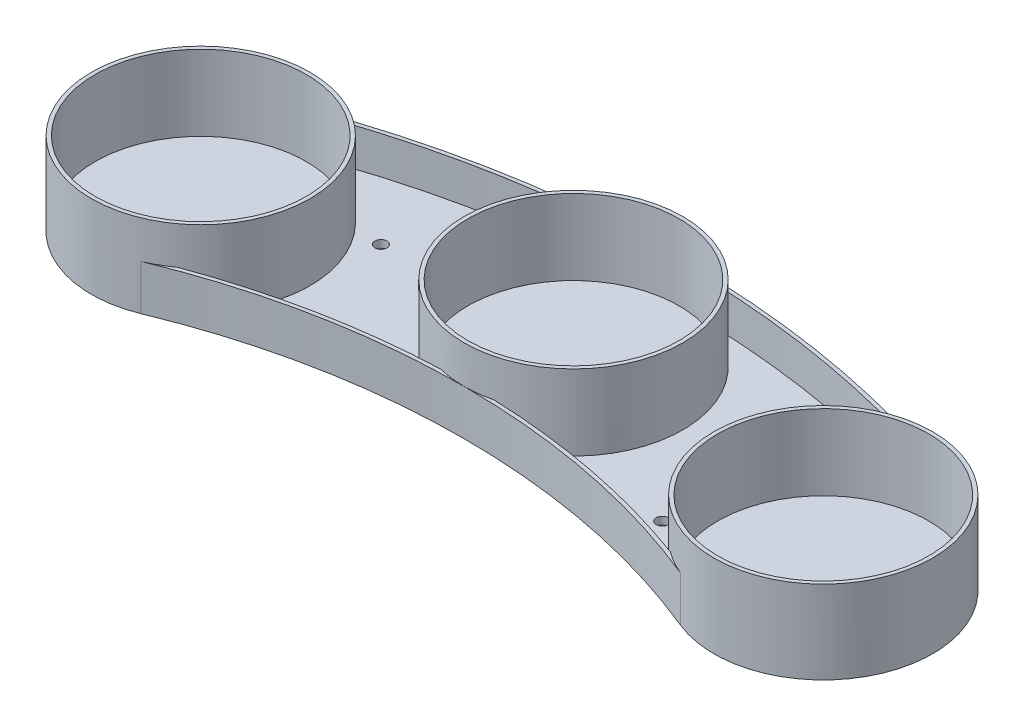
ISO-10303-21;
HEADER;
FILE_DESCRIPTION(('STEP AP214'),'2;1');
FILE_NAME('part.step','',(''),(''),'','','');
FILE_SCHEMA(('AUTOMOTIVE_DESIGN { 1 0 10303 214 1 1 1 1 }'));
ENDSEC;
DATA;
#1=APPLICATION_CONTEXT('core data for automotive mechanical design processes');
#2=APPLICATION_PROTOCOL_DEFINITION('international standard','automotive_design',2000,#1);
#3=PRODUCT_CONTEXT('',#1,'mechanical');
#4=PRODUCT('Part','Part','',(#3));
#5=PRODUCT_RELATED_PRODUCT_CATEGORY('part','',(#4));
#6=PRODUCT_DEFINITION_FORMATION('','',#4);
#7=PRODUCT_DEFINITION_CONTEXT('part definition',#1,'design');
#8=PRODUCT_DEFINITION('design','',#6,#7);
#9=PRODUCT_DEFINITION_SHAPE('','',#8);
#10=(LENGTH_UNIT() NAMED_UNIT(*) SI_UNIT(.MILLI.,.METRE.));
#11=(NAMED_UNIT(*) PLANE_ANGLE_UNIT() SI_UNIT($,.RADIAN.));
#12=(NAMED_UNIT(*) SI_UNIT($,.STERADIAN.) SOLID_ANGLE_UNIT());
#13=UNCERTAINTY_MEASURE_WITH_UNIT(LENGTH_MEASURE(1.E-05),#10,'distance_accuracy_value','');
#14=(GEOMETRIC_REPRESENTATION_CONTEXT(3) GLOBAL_UNCERTAINTY_ASSIGNED_CONTEXT((#13)) GLOBAL_UNIT_ASSIGNED_CONTEXT((#10,
#11,#12)) REPRESENTATION_CONTEXT('',''));
#15=CARTESIAN_POINT('',(0.,0.,0.));
#16=DIRECTION('',(0.,0.,1.));
#17=DIRECTION('',(1.,0.,0.));
#18=AXIS2_PLACEMENT_3D('',#15,#16,#17);
#19=CARTESIAN_POINT('',(-41.25,2.,-100.3528151075));
#20=DIRECTION('',(0.,1.,0.));
#21=DIRECTION('',(0.,0.,1.));
#22=AXIS2_PLACEMENT_3D('',#19,#20,#21);
#23=PLANE('',#22);
#24=CARTESIAN_POINT('',(-53.6033001365981,2.,-219.551101601576));
#25=DIRECTION('',(0.,1.,0.));
#26=DIRECTION('',(0.,0.,1.));
#27=AXIS2_PLACEMENT_3D('',#24,#25,#26);
#28=CIRCLE('',#27,1.6);
#29=CARTESIAN_POINT('',(-53.6033001365981,2.,-217.951101601576));
#30=VERTEX_POINT('',#29);
#31=EDGE_CURVE('E186',#30,#30,#28,.T.);
#32=ORIENTED_EDGE('',*,*,#31,.F.);
#33=EDGE_LOOP('',(#32));
#34=FACE_BOUND('',#33,.T.);
#35=CARTESIAN_POINT('',(-47.1993660494824,2.,-193.321545215547));
#36=DIRECTION('',(0.,1.,0.));
#37=DIRECTION('',(0.,0.,1.));
#38=AXIS2_PLACEMENT_3D('',#35,#36,#37);
#39=CIRCLE('',#38,1.6);
#40=CARTESIAN_POINT('',(-47.1993660494824,2.,-191.721545215547));
#41=VERTEX_POINT('',#40);
#42=EDGE_CURVE('E190',#41,#41,#39,.T.);
#43=ORIENTED_EDGE('',*,*,#42,.F.);
#44=EDGE_LOOP('',(#43));
#45=FACE_BOUND('',#44,.T.);
#46=CARTESIAN_POINT('',(-82.5,2.,-200.705630214999));
#47=DIRECTION('',(0.,1.,0.));
#48=DIRECTION('',(0.,0.,1.));
#49=AXIS2_PLACEMENT_3D('',#46,#47,#48);
#50=CIRCLE('',#49,29.);
#51=CARTESIAN_POINT('',(-65.2891805076024,2.,-177.364942727264));
#52=VERTEX_POINT('',#51);
#53=CARTESIAN_POINT('',(-85.6764539999715,2.,-229.531142178988));
#54=VERTEX_POINT('',#53);
#55=EDGE_CURVE('E219',#52,#54,#50,.T.);
#56=ORIENTED_EDGE('',*,*,#55,.F.);
#57=CARTESIAN_POINT('',(0.,2.,0.));
#58=DIRECTION('',(0.,1.,0.));
#59=DIRECTION('',(0.,0.,-1.));
#60=AXIS2_PLACEMENT_3D('',#57,#58,#59);
#61=CIRCLE('',#60,189.);
#62=CARTESIAN_POINT('',(-7.04470808755808,2.,-188.86866359447));
#63=VERTEX_POINT('',#62);
#64=EDGE_CURVE('E360',#63,#52,#61,.T.);
#65=ORIENTED_EDGE('',*,*,#64,.F.);
#66=CARTESIAN_POINT('',(0.,2.,-217.));
#67=DIRECTION('',(0.,1.,0.));
#68=DIRECTION('',(0.,0.,1.));
#69=AXIS2_PLACEMENT_3D('',#66,#67,#68);
#70=CIRCLE('',#69,29.);
#71=CARTESIAN_POINT('',(-8.02107159039558,2.,-244.86866359447));
#72=VERTEX_POINT('',#71);
#73=EDGE_CURVE('E44',#63,#72,#70,.F.);
#74=ORIENTED_EDGE('',*,*,#73,.T.);
#75=CARTESIAN_POINT('',(0.,2.,0.));
#76=DIRECTION('',(0.,-1.,0.));
#77=DIRECTION('',(0.,0.,-1.));
#78=AXIS2_PLACEMENT_3D('',#75,#76,#77);
#79=CIRCLE('',#78,245.);
#80=EDGE_CURVE('E162',#54,#72,#79,.T.);
#81=ORIENTED_EDGE('',*,*,#80,.F.);
#82=EDGE_LOOP('',(#56,#65,#74,#81));
#83=FACE_BOUND('',#82,.T.);
#84=ADVANCED_FACE('F35',(#34,#45,#83),#23,.T.);
#85=CARTESIAN_POINT('',(-82.5,2.,-200.705630214999));
#86=DIRECTION('',(0.,-1.,0.));
#87=DIRECTION('',(0.,0.,-1.));
#88=AXIS2_PLACEMENT_3D('',#85,#86,#87);
#89=CYLINDRICAL_SURFACE('',#88,29.);
#90=CARTESIAN_POINT('',(-82.5,22.,-200.705630214999));
#91=DIRECTION('',(0.,1.,0.));
#92=DIRECTION('',(0.,0.,1.));
#93=AXIS2_PLACEMENT_3D('',#90,#91,#92);
#94=CIRCLE('',#93,29.);
#95=CARTESIAN_POINT('',(-82.5,22.,-171.705630214999));
#96=VERTEX_POINT('',#95);
#97=EDGE_CURVE('E222',#96,#96,#94,.T.);
#98=ORIENTED_EDGE('',*,*,#97,.F.);
#99=EDGE_LOOP('',(#98));
#100=FACE_BOUND('',#99,.T.);
#101=DIRECTION('',(0.,-1.,0.));
#102=VECTOR('',#101,1.);
#103=CARTESIAN_POINT('',(-65.2891805076025,7.,-177.364942727264));
#104=LINE('',#103,#102);
#105=CARTESIAN_POINT('',(-65.2891805076025,12.,-177.364942727264));
#106=VERTEX_POINT('',#105);
#107=EDGE_CURVE('E349',#52,#106,#104,.F.);
#108=ORIENTED_EDGE('',*,*,#107,.F.);
#109=ORIENTED_EDGE('',*,*,#55,.T.);
#110=DIRECTION('',(0.,-1.,0.));
#111=VECTOR('',#110,1.);
#112=CARTESIAN_POINT('',(-85.676453999971,7.,-229.531142178988));
#113=LINE('',#112,#111);
#114=CARTESIAN_POINT('',(-85.6764539999715,12.,-229.531142178988));
#115=VERTEX_POINT('',#114);
#116=EDGE_CURVE('E153',#115,#54,#113,.T.);
#117=ORIENTED_EDGE('',*,*,#116,.F.);
#118=CARTESIAN_POINT('',(-82.5,12.,-200.705630214999));
#119=DIRECTION('',(0.,-1.,0.));
#120=DIRECTION('',(0.,0.,-1.));
#121=AXIS2_PLACEMENT_3D('',#118,#119,#120);
#122=CIRCLE('',#121,29.);
#123=CARTESIAN_POINT('',(-93.5253456221198,12.,-227.52804162622));
#124=VERTEX_POINT('',#123);
#125=EDGE_CURVE('E183',#124,#115,#122,.T.);
#126=ORIENTED_EDGE('',*,*,#125,.F.);
#127=DIRECTION('',(0.,-1.,0.));
#128=VECTOR('',#127,1.);
#129=CARTESIAN_POINT('',(-93.5253456221199,2.,-227.52804162622));
#130=LINE('',#129,#128);
#131=CARTESIAN_POINT('',(-93.5253456221199,0.,-227.52804162622));
#132=VERTEX_POINT('',#131);
#133=EDGE_CURVE('E160',#124,#132,#130,.T.);
#134=ORIENTED_EDGE('',*,*,#133,.T.);
#135=CARTESIAN_POINT('',(-82.5,0.,-200.705630214999));
#136=DIRECTION('',(0.,1.,0.));
#137=DIRECTION('',(0.,0.,1.));
#138=AXIS2_PLACEMENT_3D('',#135,#136,#137);
#139=CIRCLE('',#138,29.);
#140=CARTESIAN_POINT('',(-71.4746543778802,0.,-173.883218803778));
#141=VERTEX_POINT('',#140);
#142=EDGE_CURVE('E225',#132,#141,#139,.T.);
#143=ORIENTED_EDGE('',*,*,#142,.T.);
#144=DIRECTION('',(0.,-1.,0.));
#145=VECTOR('',#144,1.);
#146=CARTESIAN_POINT('',(-71.4746543778802,2.,-173.883218803778));
#147=LINE('',#146,#145);
#148=CARTESIAN_POINT('',(-71.4746543778802,12.,-173.883218803778));
#149=VERTEX_POINT('',#148);
#150=EDGE_CURVE('E52',#149,#141,#147,.T.);
#151=ORIENTED_EDGE('',*,*,#150,.F.);
#152=CARTESIAN_POINT('',(-82.5,12.,-200.705630214999));
#153=DIRECTION('',(0.,-1.,0.));
#154=DIRECTION('',(0.,0.,-1.));
#155=AXIS2_PLACEMENT_3D('',#152,#153,#154);
#156=CIRCLE('',#155,29.);
#157=EDGE_CURVE('E56',#106,#149,#156,.T.);
#158=ORIENTED_EDGE('',*,*,#157,.F.);
#159=EDGE_LOOP('',(#108,#109,#117,#126,#134,#143,#151,#158));
#160=FACE_BOUND('',#159,.T.);
#161=ADVANCED_FACE('F37',(#100,#160),#89,.T.);
#162=CARTESIAN_POINT('',(82.5,2.,-200.705630214999));
#163=DIRECTION('',(0.,-1.,0.));
#164=DIRECTION('',(0.,0.,-1.));
#165=AXIS2_PLACEMENT_3D('',#162,#163,#164);
#166=CYLINDRICAL_SURFACE('',#165,29.);
#167=CARTESIAN_POINT('',(82.5,22.,-200.705630214999));
#168=DIRECTION('',(0.,1.,0.));
#169=DIRECTION('',(0.,0.,1.));
#170=AXIS2_PLACEMENT_3D('',#167,#168,#169);
#171=CIRCLE('',#170,29.);
#172=CARTESIAN_POINT('',(82.5,22.,-171.705630214999));
#173=VERTEX_POINT('',#172);
#174=EDGE_CURVE('E202',#173,#173,#171,.T.);
#175=ORIENTED_EDGE('',*,*,#174,.F.);
#176=EDGE_LOOP('',(#175));
#177=FACE_BOUND('',#176,.T.);
#178=CARTESIAN_POINT('',(82.5,12.,-200.705630214999));
#179=DIRECTION('',(0.,-1.,0.));
#180=DIRECTION('',(0.,0.,-1.));
#181=AXIS2_PLACEMENT_3D('',#178,#179,#180);
#182=CIRCLE('',#181,29.);
#183=CARTESIAN_POINT('',(71.4746543778802,12.,-173.883218803778));
#184=VERTEX_POINT('',#183);
#185=CARTESIAN_POINT('',(65.2891805076025,12.,-177.364942727264));
#186=VERTEX_POINT('',#185);
#187=EDGE_CURVE('E383',#184,#186,#182,.T.);
#188=ORIENTED_EDGE('',*,*,#187,.F.);
#189=DIRECTION('',(0.,-1.,0.));
#190=VECTOR('',#189,1.);
#191=CARTESIAN_POINT('',(71.4746543778802,2.,-173.883218803778));
#192=LINE('',#191,#190);
#193=CARTESIAN_POINT('',(71.4746543778802,0.,-173.883218803778));
#194=VERTEX_POINT('',#193);
#195=EDGE_CURVE('E237',#184,#194,#192,.T.);
#196=ORIENTED_EDGE('',*,*,#195,.T.);
#197=CARTESIAN_POINT('',(82.5,0.,-200.705630214999));
#198=DIRECTION('',(0.,1.,0.));
#199=DIRECTION('',(0.,0.,-1.));
#200=AXIS2_PLACEMENT_3D('',#197,#198,#199);
#201=CIRCLE('',#200,29.);
#202=CARTESIAN_POINT('',(93.5253456221199,0.,-227.52804162622));
#203=VERTEX_POINT('',#202);
#204=EDGE_CURVE('E230',#194,#203,#201,.T.);
#205=ORIENTED_EDGE('',*,*,#204,.T.);
#206=DIRECTION('',(0.,-1.,0.));
#207=VECTOR('',#206,1.);
#208=CARTESIAN_POINT('',(93.5253456221199,2.,-227.52804162622));
#209=LINE('',#208,#207);
#210=CARTESIAN_POINT('',(93.5253456221198,12.,-227.52804162622));
#211=VERTEX_POINT('',#210);
#212=EDGE_CURVE('E235',#211,#203,#209,.T.);
#213=ORIENTED_EDGE('',*,*,#212,.F.);
#214=CARTESIAN_POINT('',(82.5,12.,-200.705630214999));
#215=DIRECTION('',(0.,-1.,0.));
#216=DIRECTION('',(0.,0.,-1.));
#217=AXIS2_PLACEMENT_3D('',#214,#215,#216);
#218=CIRCLE('',#217,29.);
#219=CARTESIAN_POINT('',(85.6764539999715,12.,-229.531142178988));
#220=VERTEX_POINT('',#219);
#221=EDGE_CURVE('E142',#220,#211,#218,.T.);
#222=ORIENTED_EDGE('',*,*,#221,.F.);
#223=DIRECTION('',(0.,-1.,0.));
#224=VECTOR('',#223,1.);
#225=CARTESIAN_POINT('',(85.676453999971,7.,-229.531142178988));
#226=LINE('',#225,#224);
#227=CARTESIAN_POINT('',(85.676453999971,2.,-229.531142178988));
#228=VERTEX_POINT('',#227);
#229=EDGE_CURVE('E177',#228,#220,#226,.F.);
#230=ORIENTED_EDGE('',*,*,#229,.F.);
#231=CARTESIAN_POINT('',(82.5,2.,-200.705630214999));
#232=DIRECTION('',(0.,1.,0.));
#233=DIRECTION('',(0.,0.,1.));
#234=AXIS2_PLACEMENT_3D('',#231,#232,#233);
#235=CIRCLE('',#234,29.);
#236=CARTESIAN_POINT('',(65.2891805076025,2.,-177.364942727264));
#237=VERTEX_POINT('',#236);
#238=EDGE_CURVE('E201',#228,#237,#235,.T.);
#239=ORIENTED_EDGE('',*,*,#238,.T.);
#240=DIRECTION('',(0.,-1.,0.));
#241=VECTOR('',#240,1.);
#242=CARTESIAN_POINT('',(65.2891805076025,7.,-177.364942727264));
#243=LINE('',#242,#241);
#244=EDGE_CURVE('E357',#186,#237,#243,.T.);
#245=ORIENTED_EDGE('',*,*,#244,.F.);
#246=EDGE_LOOP('',(#188,#196,#205,#213,#222,#230,#239,#245));
#247=FACE_BOUND('',#246,.T.);
#248=ADVANCED_FACE('F281',(#177,#247),#166,.T.);
#249=CARTESIAN_POINT('',(0.,22.,-217.));
#250=DIRECTION('',(0.,-1.,0.));
#251=DIRECTION('',(0.,0.,-1.));
#252=AXIS2_PLACEMENT_3D('',#249,#250,#251);
#253=CYLINDRICAL_SURFACE('',#252,29.);
#254=CARTESIAN_POINT('',(0.,22.,-217.));
#255=DIRECTION('',(0.,1.,0.));
#256=DIRECTION('',(0.,0.,1.));
#257=AXIS2_PLACEMENT_3D('',#254,#255,#256);
#258=CIRCLE('',#257,29.);
#259=CARTESIAN_POINT('',(0.,22.,-188.));
#260=VERTEX_POINT('',#259);
#261=EDGE_CURVE('E211',#260,#260,#258,.T.);
#262=ORIENTED_EDGE('',*,*,#261,.F.);
#263=EDGE_LOOP('',(#262));
#264=FACE_BOUND('',#263,.T.);
#265=DIRECTION('',(0.,-1.,0.));
#266=VECTOR('',#265,1.);
#267=CARTESIAN_POINT('',(-7.04470808755811,7.,-188.86866359447));
#268=LINE('',#267,#266);
#269=CARTESIAN_POINT('',(-7.04470808755808,12.,-188.86866359447));
#270=VERTEX_POINT('',#269);
#271=EDGE_CURVE('E365',#270,#63,#268,.T.);
#272=ORIENTED_EDGE('',*,*,#271,.F.);
#273=CARTESIAN_POINT('',(0.,12.,-217.));
#274=DIRECTION('',(0.,-1.,0.));
#275=DIRECTION('',(0.,0.,-1.));
#276=AXIS2_PLACEMENT_3D('',#273,#274,#275);
#277=CIRCLE('',#276,29.);
#278=CARTESIAN_POINT('',(0.,12.,-188.));
#279=VERTEX_POINT('',#278);
#280=EDGE_CURVE('E356',#279,#270,#277,.T.);
#281=ORIENTED_EDGE('',*,*,#280,.F.);
#282=CARTESIAN_POINT('',(7.04470808755808,12.,-188.86866359447));
#283=VERTEX_POINT('',#282);
#284=EDGE_CURVE('E382',#283,#279,#277,.T.);
#285=ORIENTED_EDGE('',*,*,#284,.F.);
#286=DIRECTION('',(0.,-1.,0.));
#287=VECTOR('',#286,1.);
#288=CARTESIAN_POINT('',(7.04470808755811,7.,-188.86866359447));
#289=LINE('',#288,#287);
#290=CARTESIAN_POINT('',(7.04470808755809,2.,-188.86866359447));
#291=VERTEX_POINT('',#290);
#292=EDGE_CURVE('E374',#291,#283,#289,.F.);
#293=ORIENTED_EDGE('',*,*,#292,.F.);
#294=CARTESIAN_POINT('',(0.,2.,-217.));
#295=DIRECTION('',(0.,1.,0.));
#296=DIRECTION('',(0.,0.,1.));
#297=AXIS2_PLACEMENT_3D('',#294,#295,#296);
#298=CIRCLE('',#297,29.);
#299=CARTESIAN_POINT('',(8.02107159039558,2.,-244.86866359447));
#300=VERTEX_POINT('',#299);
#301=EDGE_CURVE('E210',#291,#300,#298,.T.);
#302=ORIENTED_EDGE('',*,*,#301,.T.);
#303=DIRECTION('',(0.,-1.,0.));
#304=VECTOR('',#303,1.);
#305=CARTESIAN_POINT('',(8.02107159039594,7.,-244.86866359447));
#306=LINE('',#305,#304);
#307=CARTESIAN_POINT('',(8.02107159039556,12.,-244.86866359447));
#308=VERTEX_POINT('',#307);
#309=EDGE_CURVE('E137',#308,#300,#306,.T.);
#310=ORIENTED_EDGE('',*,*,#309,.F.);
#311=CARTESIAN_POINT('',(0.,12.,-217.));
#312=DIRECTION('',(0.,-1.,0.));
#313=DIRECTION('',(0.,0.,-1.));
#314=AXIS2_PLACEMENT_3D('',#311,#312,#313);
#315=CIRCLE('',#314,29.);
#316=CARTESIAN_POINT('',(0.,12.,-246.));
#317=VERTEX_POINT('',#316);
#318=EDGE_CURVE('E130',#317,#308,#315,.T.);
#319=ORIENTED_EDGE('',*,*,#318,.F.);
#320=CARTESIAN_POINT('',(-8.02107159039555,12.,-244.86866359447));
#321=VERTEX_POINT('',#320);
#322=EDGE_CURVE('E134',#321,#317,#315,.T.);
#323=ORIENTED_EDGE('',*,*,#322,.F.);
#324=DIRECTION('',(0.,-1.,0.));
#325=VECTOR('',#324,1.);
#326=CARTESIAN_POINT('',(-8.02107159039593,7.,-244.86866359447));
#327=LINE('',#326,#325);
#328=EDGE_CURVE('E175',#72,#321,#327,.F.);
#329=ORIENTED_EDGE('',*,*,#328,.F.);
#330=ORIENTED_EDGE('',*,*,#73,.F.);
#331=EDGE_LOOP('',(#272,#281,#285,#293,#302,#310,#319,#323,#329,#330));
#332=FACE_BOUND('',#331,.T.);
#333=ADVANCED_FACE('F132',(#264,#332),#253,.T.);
#334=CARTESIAN_POINT('',(47.1993660494824,2.,-193.321545215547));
#335=DIRECTION('',(0.,1.,0.));
#336=DIRECTION('',(0.,0.,-1.));
#337=AXIS2_PLACEMENT_3D('',#334,#335,#336);
#338=CIRCLE('',#337,1.6);
#339=CARTESIAN_POINT('',(47.1993660494824,2.,-194.921545215547));
#340=VERTEX_POINT('',#339);
#341=EDGE_CURVE('E185',#340,#340,#338,.T.);
#342=ORIENTED_EDGE('',*,*,#341,.F.);
#343=EDGE_LOOP('',(#342));
#344=FACE_BOUND('',#343,.T.);
#345=CARTESIAN_POINT('',(53.6033001365981,2.,-219.551101601576));
#346=DIRECTION('',(0.,1.,0.));
#347=DIRECTION('',(0.,0.,-1.));
#348=AXIS2_PLACEMENT_3D('',#345,#346,#347);
#349=CIRCLE('',#348,1.6);
#350=CARTESIAN_POINT('',(53.6033001365981,2.,-221.151101601576));
#351=VERTEX_POINT('',#350);
#352=EDGE_CURVE('E193',#351,#351,#349,.T.);
#353=ORIENTED_EDGE('',*,*,#352,.F.);
#354=EDGE_LOOP('',(#353));
#355=FACE_BOUND('',#354,.T.);
#356=ORIENTED_EDGE('',*,*,#301,.F.);
#357=EDGE_CURVE('E366',#237,#291,#61,.T.);
#358=ORIENTED_EDGE('',*,*,#357,.F.);
#359=ORIENTED_EDGE('',*,*,#238,.F.);
#360=EDGE_CURVE('E171',#300,#228,#79,.T.);
#361=ORIENTED_EDGE('',*,*,#360,.F.);
#362=EDGE_LOOP('',(#356,#358,#359,#361));
#363=FACE_BOUND('',#362,.T.);
#364=ADVANCED_FACE('F276',(#344,#355,#363),#23,.T.);
#365=CARTESIAN_POINT('',(0.,2.,0.));
#366=DIRECTION('',(0.,-1.,0.));
#367=DIRECTION('',(0.,0.,-1.));
#368=AXIS2_PLACEMENT_3D('',#365,#366,#367);
#369=CYLINDRICAL_SURFACE('',#368,188.);
#370=CARTESIAN_POINT('',(0.,0.,0.));
#371=DIRECTION('',(0.,-1.,0.));
#372=DIRECTION('',(0.,0.,-1.));
#373=AXIS2_PLACEMENT_3D('',#370,#371,#372);
#374=CIRCLE('',#373,188.);
#375=EDGE_CURVE('E228',#141,#194,#374,.T.);
#376=ORIENTED_EDGE('',*,*,#375,.T.);
#377=ORIENTED_EDGE('',*,*,#195,.F.);
#378=CARTESIAN_POINT('',(0.,12.,0.));
#379=DIRECTION('',(0.,-1.,0.));
#380=DIRECTION('',(0.,0.,-1.));
#381=AXIS2_PLACEMENT_3D('',#378,#379,#380);
#382=CIRCLE('',#381,188.);
#383=EDGE_CURVE('E369',#279,#184,#382,.T.);
#384=ORIENTED_EDGE('',*,*,#383,.F.);
#385=EDGE_CURVE('E396',#149,#279,#382,.T.);
#386=ORIENTED_EDGE('',*,*,#385,.F.);
#387=ORIENTED_EDGE('',*,*,#150,.T.);
#388=EDGE_LOOP('',(#376,#377,#384,#386,#387));
#389=FACE_BOUND('',#388,.T.);
#390=ADVANCED_FACE('F288',(#389),#369,.F.);
#391=CARTESIAN_POINT('',(0.,2.,0.));
#392=DIRECTION('',(0.,-1.,0.));
#393=DIRECTION('',(0.,0.,-1.));
#394=AXIS2_PLACEMENT_3D('',#391,#392,#393);
#395=CYLINDRICAL_SURFACE('',#394,246.);
#396=ORIENTED_EDGE('',*,*,#133,.F.);
#397=CARTESIAN_POINT('',(0.,12.,0.));
#398=DIRECTION('',(0.,1.,0.));
#399=DIRECTION('',(0.,0.,-1.));
#400=AXIS2_PLACEMENT_3D('',#397,#398,#399);
#401=CIRCLE('',#400,246.);
#402=EDGE_CURVE('E150',#317,#124,#401,.T.);
#403=ORIENTED_EDGE('',*,*,#402,.F.);
#404=EDGE_CURVE('E158',#211,#317,#401,.T.);
#405=ORIENTED_EDGE('',*,*,#404,.F.);
#406=ORIENTED_EDGE('',*,*,#212,.T.);
#407=CARTESIAN_POINT('',(0.,0.,0.));
#408=DIRECTION('',(0.,1.,0.));
#409=DIRECTION('',(0.,0.,-1.));
#410=AXIS2_PLACEMENT_3D('',#407,#408,#409);
#411=CIRCLE('',#410,246.);
#412=EDGE_CURVE('E232',#203,#132,#411,.T.);
#413=ORIENTED_EDGE('',*,*,#412,.T.);
#414=EDGE_LOOP('',(#396,#403,#405,#406,#413));
#415=FACE_BOUND('',#414,.T.);
#416=ADVANCED_FACE('F156',(#415),#395,.T.);
#417=CARTESIAN_POINT('',(-41.25,0.,-100.3528151075));
#418=DIRECTION('',(0.,1.,0.));
#419=DIRECTION('',(0.,0.,1.));
#420=AXIS2_PLACEMENT_3D('',#417,#418,#419);
#421=PLANE('',#420);
#422=CARTESIAN_POINT('',(-53.6033001365981,0.,-219.551101601576));
#423=DIRECTION('',(0.,1.,0.));
#424=DIRECTION('',(0.,0.,1.));
#425=AXIS2_PLACEMENT_3D('',#422,#423,#424);
#426=CIRCLE('',#425,1.6);
#427=CARTESIAN_POINT('',(-53.6033001365981,0.,-217.951101601576));
#428=VERTEX_POINT('',#427);
#429=EDGE_CURVE('E39',#428,#428,#426,.T.);
#430=ORIENTED_EDGE('',*,*,#429,.T.);
#431=EDGE_LOOP('',(#430));
#432=FACE_BOUND('',#431,.T.);
#433=CARTESIAN_POINT('',(47.1993660494824,0.,-193.321545215547));
#434=DIRECTION('',(0.,1.,0.));
#435=DIRECTION('',(0.,0.,1.));
#436=AXIS2_PLACEMENT_3D('',#433,#434,#435);
#437=CIRCLE('',#436,1.6);
#438=CARTESIAN_POINT('',(47.1993660494824,0.,-191.721545215547));
#439=VERTEX_POINT('',#438);
#440=EDGE_CURVE('E249',#439,#439,#437,.T.);
#441=ORIENTED_EDGE('',*,*,#440,.T.);
#442=EDGE_LOOP('',(#441));
#443=FACE_BOUND('',#442,.T.);
#444=CARTESIAN_POINT('',(53.6033001365981,0.,-219.551101601576));
#445=DIRECTION('',(0.,1.,0.));
#446=DIRECTION('',(0.,0.,1.));
#447=AXIS2_PLACEMENT_3D('',#444,#445,#446);
#448=CIRCLE('',#447,1.6);
#449=CARTESIAN_POINT('',(53.6033001365981,0.,-217.951101601576));
#450=VERTEX_POINT('',#449);
#451=EDGE_CURVE('E247',#450,#450,#448,.T.);
#452=ORIENTED_EDGE('',*,*,#451,.T.);
#453=EDGE_LOOP('',(#452));
#454=FACE_BOUND('',#453,.T.);
#455=CARTESIAN_POINT('',(-47.1993660494824,0.,-193.321545215547));
#456=DIRECTION('',(0.,1.,0.));
#457=DIRECTION('',(0.,0.,1.));
#458=AXIS2_PLACEMENT_3D('',#455,#456,#457);
#459=CIRCLE('',#458,1.6);
#460=CARTESIAN_POINT('',(-47.1993660494824,0.,-191.721545215547));
#461=VERTEX_POINT('',#460);
#462=EDGE_CURVE('E189',#461,#461,#459,.T.);
#463=ORIENTED_EDGE('',*,*,#462,.T.);
#464=EDGE_LOOP('',(#463));
#465=FACE_BOUND('',#464,.T.);
#466=ORIENTED_EDGE('',*,*,#142,.F.);
#467=ORIENTED_EDGE('',*,*,#412,.F.);
#468=ORIENTED_EDGE('',*,*,#204,.F.);
#469=ORIENTED_EDGE('',*,*,#375,.F.);
#470=EDGE_LOOP('',(#466,#467,#468,#469));
#471=FACE_BOUND('',#470,.T.);
#472=ADVANCED_FACE('F256',(#432,#443,#454,#465,#471),#421,.F.);
#473=CARTESIAN_POINT('',(-82.5,22.,-200.705630214999));
#474=DIRECTION('',(0.,1.,0.));
#475=DIRECTION('',(0.,0.,1.));
#476=AXIS2_PLACEMENT_3D('',#473,#474,#475);
#477=PLANE('',#476);
#478=ORIENTED_EDGE('',*,*,#97,.T.);
#479=EDGE_LOOP('',(#478));
#480=FACE_BOUND('',#479,.T.);
#481=CARTESIAN_POINT('',(-82.5,22.,-200.705630214999));
#482=DIRECTION('',(0.,1.,0.));
#483=DIRECTION('',(0.,0.,1.));
#484=AXIS2_PLACEMENT_3D('',#481,#482,#483);
#485=CIRCLE('',#484,28.);
#486=CARTESIAN_POINT('',(-82.5,22.,-172.705630214999));
#487=VERTEX_POINT('',#486);
#488=EDGE_CURVE('E216',#487,#487,#485,.T.);
#489=ORIENTED_EDGE('',*,*,#488,.F.);
#490=EDGE_LOOP('',(#489));
#491=FACE_BOUND('',#490,.T.);
#492=ADVANCED_FACE('F303',(#480,#491),#477,.T.);
#493=CARTESIAN_POINT('',(-82.5,22.,-200.705630214999));
#494=DIRECTION('',(0.,-1.,0.));
#495=DIRECTION('',(0.,0.,-1.));
#496=AXIS2_PLACEMENT_3D('',#493,#494,#495);
#497=CYLINDRICAL_SURFACE('',#496,28.);
#498=CARTESIAN_POINT('',(-82.5,2.,-200.705630214999));
#499=DIRECTION('',(0.,1.,0.));
#500=DIRECTION('',(0.,0.,1.));
#501=AXIS2_PLACEMENT_3D('',#498,#499,#500);
#502=CIRCLE('',#501,28.);
#503=CARTESIAN_POINT('',(-82.5,2.,-172.705630214999));
#504=VERTEX_POINT('',#503);
#505=EDGE_CURVE('E214',#504,#504,#502,.T.);
#506=ORIENTED_EDGE('',*,*,#505,.F.);
#507=EDGE_LOOP('',(#506));
#508=FACE_BOUND('',#507,.T.);
#509=ORIENTED_EDGE('',*,*,#488,.T.);
#510=EDGE_LOOP('',(#509));
#511=FACE_BOUND('',#510,.T.);
#512=ADVANCED_FACE('F293',(#508,#511),#497,.F.);
#513=ORIENTED_EDGE('',*,*,#505,.T.);
#514=EDGE_LOOP('',(#513));
#515=FACE_BOUND('',#514,.T.);
#516=ADVANCED_FACE('F277',(#515),#23,.T.);
#517=CARTESIAN_POINT('',(0.,22.,-217.));
#518=DIRECTION('',(0.,1.,0.));
#519=DIRECTION('',(0.,0.,1.));
#520=AXIS2_PLACEMENT_3D('',#517,#518,#519);
#521=PLANE('',#520);
#522=ORIENTED_EDGE('',*,*,#261,.T.);
#523=EDGE_LOOP('',(#522));
#524=FACE_BOUND('',#523,.T.);
#525=CARTESIAN_POINT('',(0.,22.,-217.));
#526=DIRECTION('',(0.,1.,0.));
#527=DIRECTION('',(0.,0.,1.));
#528=AXIS2_PLACEMENT_3D('',#525,#526,#527);
#529=CIRCLE('',#528,28.);
#530=CARTESIAN_POINT('',(0.,22.,-189.));
#531=VERTEX_POINT('',#530);
#532=EDGE_CURVE('E205',#531,#531,#529,.T.);
#533=ORIENTED_EDGE('',*,*,#532,.F.);
#534=EDGE_LOOP('',(#533));
#535=FACE_BOUND('',#534,.T.);
#536=ADVANCED_FACE('F292',(#524,#535),#521,.T.);
#537=CARTESIAN_POINT('',(0.,22.,-217.));
#538=DIRECTION('',(0.,-1.,0.));
#539=DIRECTION('',(0.,0.,-1.));
#540=AXIS2_PLACEMENT_3D('',#537,#538,#539);
#541=CYLINDRICAL_SURFACE('',#540,28.);
#542=CARTESIAN_POINT('',(0.,2.,-217.));
#543=DIRECTION('',(0.,1.,0.));
#544=DIRECTION('',(0.,0.,1.));
#545=AXIS2_PLACEMENT_3D('',#542,#543,#544);
#546=CIRCLE('',#545,28.);
#547=CARTESIAN_POINT('',(0.,2.,-189.));
#548=VERTEX_POINT('',#547);
#549=EDGE_CURVE('E241',#548,#548,#546,.F.);
#550=ORIENTED_EDGE('',*,*,#549,.T.);
#551=EDGE_LOOP('',(#550));
#552=FACE_BOUND('',#551,.T.);
#553=ORIENTED_EDGE('',*,*,#532,.T.);
#554=EDGE_LOOP('',(#553));
#555=FACE_BOUND('',#554,.T.);
#556=ADVANCED_FACE('F300',(#552,#555),#541,.F.);
#557=ORIENTED_EDGE('',*,*,#549,.F.);
#558=EDGE_LOOP('',(#557));
#559=FACE_BOUND('',#558,.T.);
#560=ADVANCED_FACE('F295',(#559),#23,.T.);
#561=CARTESIAN_POINT('',(82.5,22.,-200.705630214999));
#562=DIRECTION('',(0.,1.,0.));
#563=DIRECTION('',(0.,0.,1.));
#564=AXIS2_PLACEMENT_3D('',#561,#562,#563);
#565=PLANE('',#564);
#566=ORIENTED_EDGE('',*,*,#174,.T.);
#567=EDGE_LOOP('',(#566));
#568=FACE_BOUND('',#567,.T.);
#569=CARTESIAN_POINT('',(82.5,22.,-200.705630214999));
#570=DIRECTION('',(0.,1.,0.));
#571=DIRECTION('',(0.,0.,1.));
#572=AXIS2_PLACEMENT_3D('',#569,#570,#571);
#573=CIRCLE('',#572,28.);
#574=CARTESIAN_POINT('',(82.5,22.,-172.705630214999));
#575=VERTEX_POINT('',#574);
#576=EDGE_CURVE('E198',#575,#575,#573,.T.);
#577=ORIENTED_EDGE('',*,*,#576,.F.);
#578=EDGE_LOOP('',(#577));
#579=FACE_BOUND('',#578,.T.);
#580=ADVANCED_FACE('F307',(#568,#579),#565,.T.);
#581=CARTESIAN_POINT('',(82.5,22.,-200.705630214999));
#582=DIRECTION('',(0.,-1.,0.));
#583=DIRECTION('',(0.,0.,-1.));
#584=AXIS2_PLACEMENT_3D('',#581,#582,#583);
#585=CYLINDRICAL_SURFACE('',#584,28.);
#586=CARTESIAN_POINT('',(82.5,2.,-200.705630214999));
#587=DIRECTION('',(0.,1.,0.));
#588=DIRECTION('',(0.,0.,1.));
#589=AXIS2_PLACEMENT_3D('',#586,#587,#588);
#590=CIRCLE('',#589,28.);
#591=CARTESIAN_POINT('',(82.5,2.,-172.705630214999));
#592=VERTEX_POINT('',#591);
#593=EDGE_CURVE('E11',#592,#592,#590,.F.);
#594=ORIENTED_EDGE('',*,*,#593,.T.);
#595=EDGE_LOOP('',(#594));
#596=FACE_BOUND('',#595,.T.);
#597=ORIENTED_EDGE('',*,*,#576,.T.);
#598=EDGE_LOOP('',(#597));
#599=FACE_BOUND('',#598,.T.);
#600=ADVANCED_FACE('F313',(#596,#599),#585,.F.);
#601=ORIENTED_EDGE('',*,*,#593,.F.);
#602=EDGE_LOOP('',(#601));
#603=FACE_BOUND('',#602,.T.);
#604=ADVANCED_FACE('F290',(#603),#23,.T.);
#605=CARTESIAN_POINT('',(-47.1993660494824,-8.,-193.321545215547));
#606=DIRECTION('',(0.,1.,0.));
#607=DIRECTION('',(0.,0.,1.));
#608=AXIS2_PLACEMENT_3D('',#605,#606,#607);
#609=CYLINDRICAL_SURFACE('',#608,1.6);
#610=ORIENTED_EDGE('',*,*,#42,.T.);
#611=EDGE_LOOP('',(#610));
#612=FACE_BOUND('',#611,.T.);
#613=ORIENTED_EDGE('',*,*,#462,.F.);
#614=EDGE_LOOP('',(#613));
#615=FACE_BOUND('',#614,.T.);
#616=ADVANCED_FACE('F320',(#612,#615),#609,.F.);
#617=CARTESIAN_POINT('',(53.6033001365981,-8.,-219.551101601576));
#618=DIRECTION('',(0.,1.,0.));
#619=DIRECTION('',(0.,0.,1.));
#620=AXIS2_PLACEMENT_3D('',#617,#618,#619);
#621=CYLINDRICAL_SURFACE('',#620,1.6);
#622=ORIENTED_EDGE('',*,*,#352,.T.);
#623=EDGE_LOOP('',(#622));
#624=FACE_BOUND('',#623,.T.);
#625=ORIENTED_EDGE('',*,*,#451,.F.);
#626=EDGE_LOOP('',(#625));
#627=FACE_BOUND('',#626,.T.);
#628=ADVANCED_FACE('F269',(#624,#627),#621,.F.);
#629=CARTESIAN_POINT('',(47.1993660494824,-8.,-193.321545215547));
#630=DIRECTION('',(0.,1.,0.));
#631=DIRECTION('',(0.,0.,1.));
#632=AXIS2_PLACEMENT_3D('',#629,#630,#631);
#633=CYLINDRICAL_SURFACE('',#632,1.6);
#634=ORIENTED_EDGE('',*,*,#341,.T.);
#635=EDGE_LOOP('',(#634));
#636=FACE_BOUND('',#635,.T.);
#637=ORIENTED_EDGE('',*,*,#440,.F.);
#638=EDGE_LOOP('',(#637));
#639=FACE_BOUND('',#638,.T.);
#640=ADVANCED_FACE('F260',(#636,#639),#633,.F.);
#641=CARTESIAN_POINT('',(-53.6033001365981,-8.,-219.551101601576));
#642=DIRECTION('',(0.,1.,0.));
#643=DIRECTION('',(0.,0.,1.));
#644=AXIS2_PLACEMENT_3D('',#641,#642,#643);
#645=CYLINDRICAL_SURFACE('',#644,1.6);
#646=ORIENTED_EDGE('',*,*,#31,.T.);
#647=EDGE_LOOP('',(#646));
#648=FACE_BOUND('',#647,.T.);
#649=ORIENTED_EDGE('',*,*,#429,.F.);
#650=EDGE_LOOP('',(#649));
#651=FACE_BOUND('',#650,.T.);
#652=ADVANCED_FACE('F258',(#648,#651),#645,.F.);
#653=CARTESIAN_POINT('',(0.,12.,0.));
#654=DIRECTION('',(0.,-1.,0.));
#655=DIRECTION('',(0.,0.,-1.));
#656=AXIS2_PLACEMENT_3D('',#653,#654,#655);
#657=PLANE('',#656);
#658=CARTESIAN_POINT('',(0.,12.,0.));
#659=DIRECTION('',(0.,-1.,0.));
#660=DIRECTION('',(0.,0.,-1.));
#661=AXIS2_PLACEMENT_3D('',#658,#659,#660);
#662=CIRCLE('',#661,245.);
#663=EDGE_CURVE('E166',#308,#220,#662,.T.);
#664=ORIENTED_EDGE('',*,*,#663,.T.);
#665=ORIENTED_EDGE('',*,*,#221,.T.);
#666=ORIENTED_EDGE('',*,*,#404,.T.);
#667=ORIENTED_EDGE('',*,*,#318,.T.);
#668=EDGE_LOOP('',(#664,#665,#666,#667));
#669=FACE_BOUND('',#668,.T.);
#670=ADVANCED_FACE('F165',(#669),#657,.F.);
#671=CARTESIAN_POINT('',(0.,12.,0.));
#672=DIRECTION('',(0.,-1.,0.));
#673=DIRECTION('',(0.,0.,-1.));
#674=AXIS2_PLACEMENT_3D('',#671,#672,#673);
#675=CYLINDRICAL_SURFACE('',#674,245.);
#676=EDGE_CURVE('E152',#115,#321,#662,.T.);
#677=ORIENTED_EDGE('',*,*,#676,.F.);
#678=ORIENTED_EDGE('',*,*,#116,.T.);
#679=ORIENTED_EDGE('',*,*,#80,.T.);
#680=ORIENTED_EDGE('',*,*,#328,.T.);
#681=EDGE_LOOP('',(#677,#678,#679,#680));
#682=FACE_BOUND('',#681,.T.);
#683=ADVANCED_FACE('F267',(#682),#675,.F.);
#684=ORIENTED_EDGE('',*,*,#360,.T.);
#685=ORIENTED_EDGE('',*,*,#229,.T.);
#686=ORIENTED_EDGE('',*,*,#663,.F.);
#687=ORIENTED_EDGE('',*,*,#309,.T.);
#688=EDGE_LOOP('',(#684,#685,#686,#687));
#689=FACE_BOUND('',#688,.T.);
#690=ADVANCED_FACE('F412',(#689),#675,.F.);
#691=ORIENTED_EDGE('',*,*,#402,.T.);
#692=ORIENTED_EDGE('',*,*,#125,.T.);
#693=ORIENTED_EDGE('',*,*,#676,.T.);
#694=ORIENTED_EDGE('',*,*,#322,.T.);
#695=EDGE_LOOP('',(#691,#692,#693,#694));
#696=FACE_BOUND('',#695,.T.);
#697=ADVANCED_FACE('F148',(#696),#657,.F.);
#698=CARTESIAN_POINT('',(0.,12.,0.));
#699=DIRECTION('',(0.,-1.,0.));
#700=DIRECTION('',(0.,0.,-1.));
#701=AXIS2_PLACEMENT_3D('',#698,#699,#700);
#702=PLANE('',#701);
#703=ORIENTED_EDGE('',*,*,#383,.T.);
#704=ORIENTED_EDGE('',*,*,#187,.T.);
#705=CARTESIAN_POINT('',(0.,12.,0.));
#706=DIRECTION('',(0.,1.,0.));
#707=DIRECTION('',(0.,0.,-1.));
#708=AXIS2_PLACEMENT_3D('',#705,#706,#707);
#709=CIRCLE('',#708,189.);
#710=EDGE_CURVE('E377',#186,#283,#709,.T.);
#711=ORIENTED_EDGE('',*,*,#710,.T.);
#712=ORIENTED_EDGE('',*,*,#284,.T.);
#713=EDGE_LOOP('',(#703,#704,#711,#712));
#714=FACE_BOUND('',#713,.T.);
#715=ADVANCED_FACE('F392',(#714),#702,.F.);
#716=CARTESIAN_POINT('',(0.,12.,0.));
#717=DIRECTION('',(0.,-1.,0.));
#718=DIRECTION('',(0.,0.,-1.));
#719=AXIS2_PLACEMENT_3D('',#716,#717,#718);
#720=CYLINDRICAL_SURFACE('',#719,189.);
#721=ORIENTED_EDGE('',*,*,#64,.T.);
#722=ORIENTED_EDGE('',*,*,#107,.T.);
#723=EDGE_CURVE('E372',#270,#106,#709,.T.);
#724=ORIENTED_EDGE('',*,*,#723,.F.);
#725=ORIENTED_EDGE('',*,*,#271,.T.);
#726=EDGE_LOOP('',(#721,#722,#724,#725));
#727=FACE_BOUND('',#726,.T.);
#728=ADVANCED_FACE('F364',(#727),#720,.T.);
#729=ORIENTED_EDGE('',*,*,#710,.F.);
#730=ORIENTED_EDGE('',*,*,#244,.T.);
#731=ORIENTED_EDGE('',*,*,#357,.T.);
#732=ORIENTED_EDGE('',*,*,#292,.T.);
#733=EDGE_LOOP('',(#729,#730,#731,#732));
#734=FACE_BOUND('',#733,.T.);
#735=ADVANCED_FACE('F407',(#734),#720,.T.);
#736=ORIENTED_EDGE('',*,*,#723,.T.);
#737=ORIENTED_EDGE('',*,*,#157,.T.);
#738=ORIENTED_EDGE('',*,*,#385,.T.);
#739=ORIENTED_EDGE('',*,*,#280,.T.);
#740=EDGE_LOOP('',(#736,#737,#738,#739));
#741=FACE_BOUND('',#740,.T.);
#742=ADVANCED_FACE('F398',(#741),#702,.F.);
#743=CLOSED_SHELL('',(#84,#161,#248,#333,#364,#390,#416,#472,#492,#512,#516,#536,#556,#560,#580,
#600,#604,#616,#628,#640,#652,#670,#683,#690,#697,#715,#728,#735,#742));
#744=MANIFOLD_SOLID_BREP('B2',#743);
#745=ADVANCED_BREP_SHAPE_REPRESENTATION('',(#18,#744),#14);
#746=SHAPE_DEFINITION_REPRESENTATION(#9,#745);
ENDSEC;
END-ISO-10303-21;
